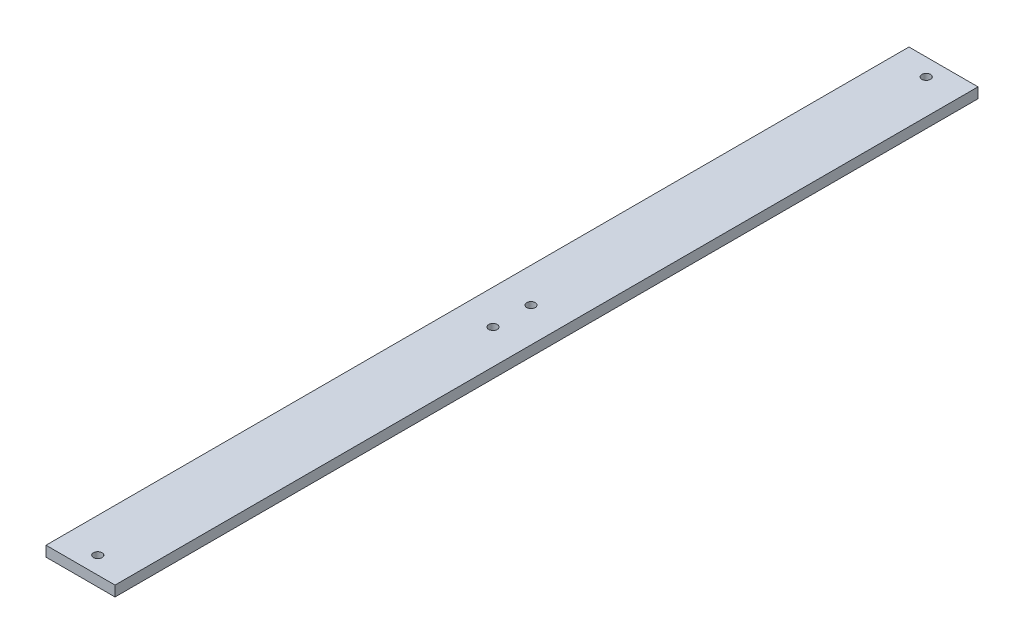
ISO-10303-21;
HEADER;
FILE_DESCRIPTION(('STEP AP214'),'2;1');
FILE_NAME('part.step','',(''),(''),'','','');
FILE_SCHEMA(('AUTOMOTIVE_DESIGN { 1 0 10303 214 1 1 1 1 }'));
ENDSEC;
DATA;
#1=APPLICATION_CONTEXT('core data for automotive mechanical design processes');
#2=APPLICATION_PROTOCOL_DEFINITION('international standard','automotive_design',2000,#1);
#3=PRODUCT_CONTEXT('',#1,'mechanical');
#4=PRODUCT('Part','Part','',(#3));
#5=PRODUCT_RELATED_PRODUCT_CATEGORY('part','',(#4));
#6=PRODUCT_DEFINITION_FORMATION('','',#4);
#7=PRODUCT_DEFINITION_CONTEXT('part definition',#1,'design');
#8=PRODUCT_DEFINITION('design','',#6,#7);
#9=PRODUCT_DEFINITION_SHAPE('','',#8);
#10=(LENGTH_UNIT() NAMED_UNIT(*) SI_UNIT(.MILLI.,.METRE.));
#11=(NAMED_UNIT(*) PLANE_ANGLE_UNIT() SI_UNIT($,.RADIAN.));
#12=(NAMED_UNIT(*) SI_UNIT($,.STERADIAN.) SOLID_ANGLE_UNIT());
#13=UNCERTAINTY_MEASURE_WITH_UNIT(LENGTH_MEASURE(1.E-05),#10,'distance_accuracy_value','');
#14=(GEOMETRIC_REPRESENTATION_CONTEXT(3) GLOBAL_UNCERTAINTY_ASSIGNED_CONTEXT((#13)) GLOBAL_UNIT_ASSIGNED_CONTEXT((#10,
#11,#12)) REPRESENTATION_CONTEXT('',''));
#15=CARTESIAN_POINT('',(0.,0.,0.));
#16=DIRECTION('',(0.,0.,1.));
#17=DIRECTION('',(1.,0.,0.));
#18=AXIS2_PLACEMENT_3D('',#15,#16,#17);
#19=CARTESIAN_POINT('',(0.,0.,500.));
#20=DIRECTION('',(1.,0.,0.));
#21=DIRECTION('',(0.,0.,-1.));
#22=AXIS2_PLACEMENT_3D('',#19,#20,#21);
#23=PLANE('',#22);
#24=DIRECTION('',(0.,-1.,0.));
#25=VECTOR('',#24,1.);
#26=CARTESIAN_POINT('',(0.,0.,0.));
#27=LINE('',#26,#25);
#28=CARTESIAN_POINT('',(0.,6.,0.));
#29=VERTEX_POINT('',#28);
#30=CARTESIAN_POINT('',(0.,0.,0.));
#31=VERTEX_POINT('',#30);
#32=EDGE_CURVE('E106',#29,#31,#27,.T.);
#33=ORIENTED_EDGE('',*,*,#32,.T.);
#34=DIRECTION('',(0.,0.,-1.));
#35=VECTOR('',#34,1.);
#36=CARTESIAN_POINT('',(0.,0.,500.));
#37=LINE('',#36,#35);
#38=CARTESIAN_POINT('',(0.,0.,500.));
#39=VERTEX_POINT('',#38);
#40=EDGE_CURVE('E11',#39,#31,#37,.T.);
#41=ORIENTED_EDGE('',*,*,#40,.F.);
#42=DIRECTION('',(0.,-1.,0.));
#43=VECTOR('',#42,1.);
#44=CARTESIAN_POINT('',(0.,0.,500.));
#45=LINE('',#44,#43);
#46=CARTESIAN_POINT('',(0.,6.,500.));
#47=VERTEX_POINT('',#46);
#48=EDGE_CURVE('E90',#47,#39,#45,.T.);
#49=ORIENTED_EDGE('',*,*,#48,.F.);
#50=DIRECTION('',(0.,0.,-1.));
#51=VECTOR('',#50,1.);
#52=CARTESIAN_POINT('',(0.,6.,500.));
#53=LINE('',#52,#51);
#54=EDGE_CURVE('E102',#47,#29,#53,.T.);
#55=ORIENTED_EDGE('',*,*,#54,.T.);
#56=EDGE_LOOP('',(#33,#41,#49,#55));
#57=FACE_BOUND('',#56,.T.);
#58=ADVANCED_FACE('F38',(#57),#23,.F.);
#59=CARTESIAN_POINT('',(0.,0.,500.));
#60=DIRECTION('',(0.,1.,0.));
#61=DIRECTION('',(0.,0.,1.));
#62=AXIS2_PLACEMENT_3D('',#59,#60,#61);
#63=PLANE('',#62);
#64=CARTESIAN_POINT('',(20.,0.,261.));
#65=DIRECTION('',(0.,1.,0.));
#66=DIRECTION('',(0.,0.,1.));
#67=AXIS2_PLACEMENT_3D('',#64,#65,#66);
#68=CIRCLE('',#67,2.5);
#69=CARTESIAN_POINT('',(20.,0.,263.5));
#70=VERTEX_POINT('',#69);
#71=EDGE_CURVE('E150',#70,#70,#68,.T.);
#72=ORIENTED_EDGE('',*,*,#71,.T.);
#73=EDGE_LOOP('',(#72));
#74=FACE_BOUND('',#73,.T.);
#75=CARTESIAN_POINT('',(20.,0.,239.));
#76=DIRECTION('',(0.,1.,0.));
#77=DIRECTION('',(0.,0.,1.));
#78=AXIS2_PLACEMENT_3D('',#75,#76,#77);
#79=CIRCLE('',#78,2.5);
#80=CARTESIAN_POINT('',(20.,0.,241.5));
#81=VERTEX_POINT('',#80);
#82=EDGE_CURVE('E142',#81,#81,#79,.T.);
#83=ORIENTED_EDGE('',*,*,#82,.T.);
#84=EDGE_LOOP('',(#83));
#85=FACE_BOUND('',#84,.T.);
#86=CARTESIAN_POINT('',(20.,0.,490.));
#87=DIRECTION('',(0.,1.,0.));
#88=DIRECTION('',(0.,0.,1.));
#89=AXIS2_PLACEMENT_3D('',#86,#87,#88);
#90=CIRCLE('',#89,2.5);
#91=CARTESIAN_POINT('',(20.,0.,492.5));
#92=VERTEX_POINT('',#91);
#93=EDGE_CURVE('E134',#92,#92,#90,.T.);
#94=ORIENTED_EDGE('',*,*,#93,.T.);
#95=EDGE_LOOP('',(#94));
#96=FACE_BOUND('',#95,.T.);
#97=CARTESIAN_POINT('',(20.,0.,10.));
#98=DIRECTION('',(0.,1.,0.));
#99=DIRECTION('',(0.,0.,1.));
#100=AXIS2_PLACEMENT_3D('',#97,#98,#99);
#101=CIRCLE('',#100,2.5);
#102=CARTESIAN_POINT('',(20.,0.,12.5));
#103=VERTEX_POINT('',#102);
#104=EDGE_CURVE('E110',#103,#103,#101,.T.);
#105=ORIENTED_EDGE('',*,*,#104,.T.);
#106=EDGE_LOOP('',(#105));
#107=FACE_BOUND('',#106,.T.);
#108=DIRECTION('',(1.,0.,0.));
#109=VECTOR('',#108,1.);
#110=CARTESIAN_POINT('',(0.,0.,0.));
#111=LINE('',#110,#109);
#112=CARTESIAN_POINT('',(40.,0.,0.));
#113=VERTEX_POINT('',#112);
#114=EDGE_CURVE('E95',#31,#113,#111,.T.);
#115=ORIENTED_EDGE('',*,*,#114,.T.);
#116=DIRECTION('',(0.,0.,-1.));
#117=VECTOR('',#116,1.);
#118=CARTESIAN_POINT('',(40.,0.,500.));
#119=LINE('',#118,#117);
#120=CARTESIAN_POINT('',(40.,0.,500.));
#121=VERTEX_POINT('',#120);
#122=EDGE_CURVE('E47',#121,#113,#119,.T.);
#123=ORIENTED_EDGE('',*,*,#122,.F.);
#124=DIRECTION('',(1.,0.,0.));
#125=VECTOR('',#124,1.);
#126=CARTESIAN_POINT('',(0.,0.,500.));
#127=LINE('',#126,#125);
#128=EDGE_CURVE('E85',#39,#121,#127,.T.);
#129=ORIENTED_EDGE('',*,*,#128,.F.);
#130=ORIENTED_EDGE('',*,*,#40,.T.);
#131=EDGE_LOOP('',(#115,#123,#129,#130));
#132=FACE_BOUND('',#131,.T.);
#133=ADVANCED_FACE('F94',(#74,#85,#96,#107,#132),#63,.F.);
#134=CARTESIAN_POINT('',(40.,0.,500.));
#135=DIRECTION('',(-1.,0.,0.));
#136=DIRECTION('',(0.,0.,1.));
#137=AXIS2_PLACEMENT_3D('',#134,#135,#136);
#138=PLANE('',#137);
#139=DIRECTION('',(0.,1.,0.));
#140=VECTOR('',#139,1.);
#141=CARTESIAN_POINT('',(40.,0.,0.));
#142=LINE('',#141,#140);
#143=CARTESIAN_POINT('',(40.,6.,0.));
#144=VERTEX_POINT('',#143);
#145=EDGE_CURVE('E72',#113,#144,#142,.T.);
#146=ORIENTED_EDGE('',*,*,#145,.T.);
#147=DIRECTION('',(0.,0.,-1.));
#148=VECTOR('',#147,1.);
#149=CARTESIAN_POINT('',(40.,6.,500.));
#150=LINE('',#149,#148);
#151=CARTESIAN_POINT('',(40.,6.,500.));
#152=VERTEX_POINT('',#151);
#153=EDGE_CURVE('E97',#152,#144,#150,.T.);
#154=ORIENTED_EDGE('',*,*,#153,.F.);
#155=DIRECTION('',(0.,1.,0.));
#156=VECTOR('',#155,1.);
#157=CARTESIAN_POINT('',(40.,0.,500.));
#158=LINE('',#157,#156);
#159=EDGE_CURVE('E88',#121,#152,#158,.T.);
#160=ORIENTED_EDGE('',*,*,#159,.F.);
#161=ORIENTED_EDGE('',*,*,#122,.T.);
#162=EDGE_LOOP('',(#146,#154,#160,#161));
#163=FACE_BOUND('',#162,.T.);
#164=ADVANCED_FACE('F98',(#163),#138,.F.);
#165=CARTESIAN_POINT('',(0.,6.,500.));
#166=DIRECTION('',(0.,-1.,0.));
#167=DIRECTION('',(0.,0.,-1.));
#168=AXIS2_PLACEMENT_3D('',#165,#166,#167);
#169=PLANE('',#168);
#170=CARTESIAN_POINT('',(20.,6.,261.));
#171=DIRECTION('',(0.,1.,0.));
#172=DIRECTION('',(0.,0.,1.));
#173=AXIS2_PLACEMENT_3D('',#170,#171,#172);
#174=CIRCLE('',#173,2.5);
#175=CARTESIAN_POINT('',(20.,6.,263.5));
#176=VERTEX_POINT('',#175);
#177=EDGE_CURVE('E154',#176,#176,#174,.T.);
#178=ORIENTED_EDGE('',*,*,#177,.F.);
#179=EDGE_LOOP('',(#178));
#180=FACE_BOUND('',#179,.T.);
#181=CARTESIAN_POINT('',(20.,6.,239.));
#182=DIRECTION('',(0.,1.,0.));
#183=DIRECTION('',(0.,0.,1.));
#184=AXIS2_PLACEMENT_3D('',#181,#182,#183);
#185=CIRCLE('',#184,2.5);
#186=CARTESIAN_POINT('',(20.,6.,241.5));
#187=VERTEX_POINT('',#186);
#188=EDGE_CURVE('E146',#187,#187,#185,.T.);
#189=ORIENTED_EDGE('',*,*,#188,.F.);
#190=EDGE_LOOP('',(#189));
#191=FACE_BOUND('',#190,.T.);
#192=CARTESIAN_POINT('',(20.,6.,490.));
#193=DIRECTION('',(0.,1.,0.));
#194=DIRECTION('',(0.,0.,1.));
#195=AXIS2_PLACEMENT_3D('',#192,#193,#194);
#196=CIRCLE('',#195,2.5);
#197=CARTESIAN_POINT('',(20.,6.,492.5));
#198=VERTEX_POINT('',#197);
#199=EDGE_CURVE('E138',#198,#198,#196,.T.);
#200=ORIENTED_EDGE('',*,*,#199,.F.);
#201=EDGE_LOOP('',(#200));
#202=FACE_BOUND('',#201,.T.);
#203=CARTESIAN_POINT('',(20.,6.,10.));
#204=DIRECTION('',(0.,1.,0.));
#205=DIRECTION('',(0.,0.,1.));
#206=AXIS2_PLACEMENT_3D('',#203,#204,#205);
#207=CIRCLE('',#206,2.5);
#208=CARTESIAN_POINT('',(20.,6.,12.5));
#209=VERTEX_POINT('',#208);
#210=EDGE_CURVE('E130',#209,#209,#207,.T.);
#211=ORIENTED_EDGE('',*,*,#210,.F.);
#212=EDGE_LOOP('',(#211));
#213=FACE_BOUND('',#212,.T.);
#214=DIRECTION('',(-1.,0.,0.));
#215=VECTOR('',#214,1.);
#216=CARTESIAN_POINT('',(0.,6.,0.));
#217=LINE('',#216,#215);
#218=EDGE_CURVE('E78',#144,#29,#217,.T.);
#219=ORIENTED_EDGE('',*,*,#218,.T.);
#220=ORIENTED_EDGE('',*,*,#54,.F.);
#221=DIRECTION('',(-1.,0.,0.));
#222=VECTOR('',#221,1.);
#223=CARTESIAN_POINT('',(0.,6.,500.));
#224=LINE('',#223,#222);
#225=EDGE_CURVE('E55',#152,#47,#224,.T.);
#226=ORIENTED_EDGE('',*,*,#225,.F.);
#227=ORIENTED_EDGE('',*,*,#153,.T.);
#228=EDGE_LOOP('',(#219,#220,#226,#227));
#229=FACE_BOUND('',#228,.T.);
#230=ADVANCED_FACE('F120',(#180,#191,#202,#213,#229),#169,.F.);
#231=CARTESIAN_POINT('',(0.,0.,500.));
#232=DIRECTION('',(0.,0.,-1.));
#233=DIRECTION('',(-1.,0.,0.));
#234=AXIS2_PLACEMENT_3D('',#231,#232,#233);
#235=PLANE('',#234);
#236=ORIENTED_EDGE('',*,*,#48,.T.);
#237=ORIENTED_EDGE('',*,*,#128,.T.);
#238=ORIENTED_EDGE('',*,*,#159,.T.);
#239=ORIENTED_EDGE('',*,*,#225,.T.);
#240=EDGE_LOOP('',(#236,#237,#238,#239));
#241=FACE_BOUND('',#240,.T.);
#242=ADVANCED_FACE('F86',(#241),#235,.F.);
#243=CARTESIAN_POINT('',(0.,0.,0.));
#244=DIRECTION('',(0.,0.,-1.));
#245=DIRECTION('',(-1.,0.,0.));
#246=AXIS2_PLACEMENT_3D('',#243,#244,#245);
#247=PLANE('',#246);
#248=ORIENTED_EDGE('',*,*,#32,.F.);
#249=ORIENTED_EDGE('',*,*,#218,.F.);
#250=ORIENTED_EDGE('',*,*,#145,.F.);
#251=ORIENTED_EDGE('',*,*,#114,.F.);
#252=EDGE_LOOP('',(#248,#249,#250,#251));
#253=FACE_BOUND('',#252,.T.);
#254=ADVANCED_FACE('F123',(#253),#247,.T.);
#255=CARTESIAN_POINT('',(20.,-4.,10.));
#256=DIRECTION('',(0.,1.,0.));
#257=DIRECTION('',(0.,0.,1.));
#258=AXIS2_PLACEMENT_3D('',#255,#256,#257);
#259=CYLINDRICAL_SURFACE('',#258,2.5);
#260=ORIENTED_EDGE('',*,*,#210,.T.);
#261=EDGE_LOOP('',(#260));
#262=FACE_BOUND('',#261,.T.);
#263=ORIENTED_EDGE('',*,*,#104,.F.);
#264=EDGE_LOOP('',(#263));
#265=FACE_BOUND('',#264,.T.);
#266=ADVANCED_FACE('F171',(#262,#265),#259,.F.);
#267=CARTESIAN_POINT('',(20.,-4.,490.));
#268=DIRECTION('',(0.,1.,0.));
#269=DIRECTION('',(0.,0.,1.));
#270=AXIS2_PLACEMENT_3D('',#267,#268,#269);
#271=CYLINDRICAL_SURFACE('',#270,2.5);
#272=ORIENTED_EDGE('',*,*,#199,.T.);
#273=EDGE_LOOP('',(#272));
#274=FACE_BOUND('',#273,.T.);
#275=ORIENTED_EDGE('',*,*,#93,.F.);
#276=EDGE_LOOP('',(#275));
#277=FACE_BOUND('',#276,.T.);
#278=ADVANCED_FACE('F174',(#274,#277),#271,.F.);
#279=CARTESIAN_POINT('',(20.,-4.,239.));
#280=DIRECTION('',(0.,1.,0.));
#281=DIRECTION('',(0.,0.,1.));
#282=AXIS2_PLACEMENT_3D('',#279,#280,#281);
#283=CYLINDRICAL_SURFACE('',#282,2.5);
#284=ORIENTED_EDGE('',*,*,#188,.T.);
#285=EDGE_LOOP('',(#284));
#286=FACE_BOUND('',#285,.T.);
#287=ORIENTED_EDGE('',*,*,#82,.F.);
#288=EDGE_LOOP('',(#287));
#289=FACE_BOUND('',#288,.T.);
#290=ADVANCED_FACE('F194',(#286,#289),#283,.F.);
#291=CARTESIAN_POINT('',(20.,-4.,261.));
#292=DIRECTION('',(0.,1.,0.));
#293=DIRECTION('',(0.,0.,1.));
#294=AXIS2_PLACEMENT_3D('',#291,#292,#293);
#295=CYLINDRICAL_SURFACE('',#294,2.5);
#296=ORIENTED_EDGE('',*,*,#177,.T.);
#297=EDGE_LOOP('',(#296));
#298=FACE_BOUND('',#297,.T.);
#299=ORIENTED_EDGE('',*,*,#71,.F.);
#300=EDGE_LOOP('',(#299));
#301=FACE_BOUND('',#300,.T.);
#302=ADVANCED_FACE('F159',(#298,#301),#295,.F.);
#303=CLOSED_SHELL('',(#58,#133,#164,#230,#242,#254,#266,#278,#290,#302));
#304=MANIFOLD_SOLID_BREP('B2',#303);
#305=ADVANCED_BREP_SHAPE_REPRESENTATION('',(#18,#304),#14);
#306=SHAPE_DEFINITION_REPRESENTATION(#9,#305);
ENDSEC;
END-ISO-10303-21;
